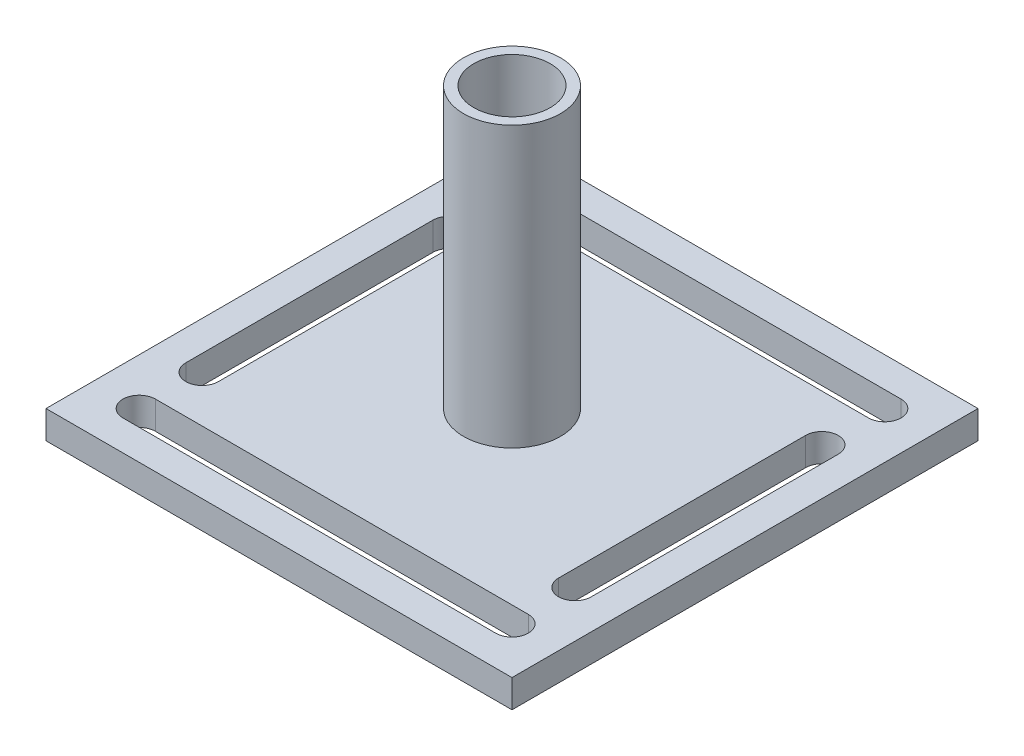
ISO-10303-21;
HEADER;
FILE_DESCRIPTION(('STEP AP214'),'2;1');
FILE_NAME('part.step','',(''),(''),'','','');
FILE_SCHEMA(('AUTOMOTIVE_DESIGN { 1 0 10303 214 1 1 1 1 }'));
ENDSEC;
DATA;
#1=APPLICATION_CONTEXT('core data for automotive mechanical design processes');
#2=APPLICATION_PROTOCOL_DEFINITION('international standard','automotive_design',2000,#1);
#3=PRODUCT_CONTEXT('',#1,'mechanical');
#4=PRODUCT('Part','Part','',(#3));
#5=PRODUCT_RELATED_PRODUCT_CATEGORY('part','',(#4));
#6=PRODUCT_DEFINITION_FORMATION('','',#4);
#7=PRODUCT_DEFINITION_CONTEXT('part definition',#1,'design');
#8=PRODUCT_DEFINITION('design','',#6,#7);
#9=PRODUCT_DEFINITION_SHAPE('','',#8);
#10=(LENGTH_UNIT() NAMED_UNIT(*) SI_UNIT(.MILLI.,.METRE.));
#11=(NAMED_UNIT(*) PLANE_ANGLE_UNIT() SI_UNIT($,.RADIAN.));
#12=(NAMED_UNIT(*) SI_UNIT($,.STERADIAN.) SOLID_ANGLE_UNIT());
#13=UNCERTAINTY_MEASURE_WITH_UNIT(LENGTH_MEASURE(1.E-05),#10,'distance_accuracy_value','');
#14=(GEOMETRIC_REPRESENTATION_CONTEXT(3) GLOBAL_UNCERTAINTY_ASSIGNED_CONTEXT((#13)) GLOBAL_UNIT_ASSIGNED_CONTEXT((#10,
#11,#12)) REPRESENTATION_CONTEXT('',''));
#15=CARTESIAN_POINT('',(0.,0.,0.));
#16=DIRECTION('',(0.,0.,1.));
#17=DIRECTION('',(1.,0.,0.));
#18=AXIS2_PLACEMENT_3D('',#15,#16,#17);
#19=CARTESIAN_POINT('',(0.,3.,0.));
#20=DIRECTION('',(0.,-1.,0.));
#21=DIRECTION('',(0.,0.,-1.));
#22=AXIS2_PLACEMENT_3D('',#19,#20,#21);
#23=PLANE('',#22);
#24=CARTESIAN_POINT('',(45.,3.,-38.25));
#25=DIRECTION('',(0.,-1.,0.));
#26=DIRECTION('',(0.,0.,-1.));
#27=AXIS2_PLACEMENT_3D('',#24,#25,#26);
#28=CIRCLE('',#27,1.75000000000001);
#29=CARTESIAN_POINT('',(46.75,3.,-38.25));
#30=VERTEX_POINT('',#29);
#31=CARTESIAN_POINT('',(43.25,3.,-38.25));
#32=VERTEX_POINT('',#31);
#33=EDGE_CURVE('E347',#30,#32,#28,.F.);
#34=ORIENTED_EDGE('',*,*,#33,.F.);
#35=DIRECTION('',(0.,0.,-1.));
#36=VECTOR('',#35,1.);
#37=CARTESIAN_POINT('',(46.75,3.,0.));
#38=LINE('',#37,#36);
#39=CARTESIAN_POINT('',(46.75,3.,-11.75));
#40=VERTEX_POINT('',#39);
#41=EDGE_CURVE('E337',#40,#30,#38,.T.);
#42=ORIENTED_EDGE('',*,*,#41,.F.);
#43=CARTESIAN_POINT('',(45.,3.,-11.75));
#44=DIRECTION('',(0.,-1.,0.));
#45=DIRECTION('',(0.,0.,-1.));
#46=AXIS2_PLACEMENT_3D('',#43,#44,#45);
#47=CIRCLE('',#46,1.75);
#48=CARTESIAN_POINT('',(43.25,3.,-11.75));
#49=VERTEX_POINT('',#48);
#50=EDGE_CURVE('E340',#49,#40,#47,.F.);
#51=ORIENTED_EDGE('',*,*,#50,.F.);
#52=DIRECTION('',(0.,0.,-1.));
#53=VECTOR('',#52,1.);
#54=CARTESIAN_POINT('',(43.25,3.,0.));
#55=LINE('',#54,#53);
#56=EDGE_CURVE('E343',#49,#32,#55,.T.);
#57=ORIENTED_EDGE('',*,*,#56,.T.);
#58=EDGE_LOOP('',(#34,#42,#51,#57));
#59=FACE_BOUND('',#58,.T.);
#60=CARTESIAN_POINT('',(5.,3.,-5.));
#61=DIRECTION('',(0.,-1.,0.));
#62=DIRECTION('',(0.,0.,-1.));
#63=AXIS2_PLACEMENT_3D('',#60,#61,#62);
#64=CIRCLE('',#63,1.75);
#65=CARTESIAN_POINT('',(5.,3.,-3.25000000000001));
#66=VERTEX_POINT('',#65);
#67=CARTESIAN_POINT('',(5.,3.,-6.75000000000001));
#68=VERTEX_POINT('',#67);
#69=EDGE_CURVE('E329',#66,#68,#64,.T.);
#70=ORIENTED_EDGE('',*,*,#69,.T.);
#71=DIRECTION('',(1.,0.,0.));
#72=VECTOR('',#71,1.);
#73=CARTESIAN_POINT('',(0.,3.,-6.75000000000001));
#74=LINE('',#73,#72);
#75=CARTESIAN_POINT('',(45.,3.,-6.75000000000001));
#76=VERTEX_POINT('',#75);
#77=EDGE_CURVE('E333',#68,#76,#74,.T.);
#78=ORIENTED_EDGE('',*,*,#77,.T.);
#79=CARTESIAN_POINT('',(45.,3.,-5.));
#80=DIRECTION('',(0.,-1.,0.));
#81=DIRECTION('',(0.,0.,-1.));
#82=AXIS2_PLACEMENT_3D('',#79,#80,#81);
#83=CIRCLE('',#82,1.75);
#84=CARTESIAN_POINT('',(45.,3.,-3.25));
#85=VERTEX_POINT('',#84);
#86=EDGE_CURVE('E324',#76,#85,#83,.T.);
#87=ORIENTED_EDGE('',*,*,#86,.T.);
#88=DIRECTION('',(1.,0.,0.));
#89=VECTOR('',#88,1.);
#90=CARTESIAN_POINT('',(0.,3.,-3.25000000000001));
#91=LINE('',#90,#89);
#92=EDGE_CURVE('E189',#66,#85,#91,.T.);
#93=ORIENTED_EDGE('',*,*,#92,.F.);
#94=EDGE_LOOP('',(#70,#78,#87,#93));
#95=FACE_BOUND('',#94,.T.);
#96=CARTESIAN_POINT('',(5.00000000000001,3.,-11.75));
#97=DIRECTION('',(0.,-1.,0.));
#98=DIRECTION('',(0.,0.,-1.));
#99=AXIS2_PLACEMENT_3D('',#96,#97,#98);
#100=CIRCLE('',#99,1.75);
#101=CARTESIAN_POINT('',(6.75000000000001,3.,-11.75));
#102=VERTEX_POINT('',#101);
#103=CARTESIAN_POINT('',(3.25,3.,-11.75));
#104=VERTEX_POINT('',#103);
#105=EDGE_CURVE('E316',#102,#104,#100,.T.);
#106=ORIENTED_EDGE('',*,*,#105,.T.);
#107=DIRECTION('',(0.,0.,-1.));
#108=VECTOR('',#107,1.);
#109=CARTESIAN_POINT('',(3.25,3.,0.));
#110=LINE('',#109,#108);
#111=CARTESIAN_POINT('',(3.25000000000001,3.,-38.25));
#112=VERTEX_POINT('',#111);
#113=EDGE_CURVE('E320',#104,#112,#110,.T.);
#114=ORIENTED_EDGE('',*,*,#113,.T.);
#115=CARTESIAN_POINT('',(5.00000000000001,3.,-38.25));
#116=DIRECTION('',(0.,-1.,0.));
#117=DIRECTION('',(0.,0.,-1.));
#118=AXIS2_PLACEMENT_3D('',#115,#116,#117);
#119=CIRCLE('',#118,1.75);
#120=CARTESIAN_POINT('',(6.75000000000001,3.,-38.25));
#121=VERTEX_POINT('',#120);
#122=EDGE_CURVE('E299',#112,#121,#119,.T.);
#123=ORIENTED_EDGE('',*,*,#122,.T.);
#124=DIRECTION('',(0.,0.,-1.));
#125=VECTOR('',#124,1.);
#126=CARTESIAN_POINT('',(6.75,3.,0.));
#127=LINE('',#126,#125);
#128=EDGE_CURVE('E312',#102,#121,#127,.T.);
#129=ORIENTED_EDGE('',*,*,#128,.F.);
#130=EDGE_LOOP('',(#106,#114,#123,#129));
#131=FACE_BOUND('',#130,.T.);
#132=CARTESIAN_POINT('',(25.,3.,-25.));
#133=DIRECTION('',(0.,-1.,0.));
#134=DIRECTION('',(0.,0.,-1.));
#135=AXIS2_PLACEMENT_3D('',#132,#133,#134);
#136=CIRCLE('',#135,5.2);
#137=CARTESIAN_POINT('',(25.,3.,-30.2));
#138=VERTEX_POINT('',#137);
#139=EDGE_CURVE('E11',#138,#138,#136,.F.);
#140=ORIENTED_EDGE('',*,*,#139,.F.);
#141=EDGE_LOOP('',(#140));
#142=FACE_BOUND('',#141,.T.);
#143=DIRECTION('',(0.,0.,1.));
#144=VECTOR('',#143,1.);
#145=CARTESIAN_POINT('',(0.,3.,0.));
#146=LINE('',#145,#144);
#147=CARTESIAN_POINT('',(0.,3.,-50.));
#148=VERTEX_POINT('',#147);
#149=CARTESIAN_POINT('',(0.,3.,0.));
#150=VERTEX_POINT('',#149);
#151=EDGE_CURVE('E375',#148,#150,#146,.T.);
#152=ORIENTED_EDGE('',*,*,#151,.T.);
#153=DIRECTION('',(1.,0.,0.));
#154=VECTOR('',#153,1.);
#155=CARTESIAN_POINT('',(0.,3.,0.));
#156=LINE('',#155,#154);
#157=CARTESIAN_POINT('',(50.,3.,0.));
#158=VERTEX_POINT('',#157);
#159=EDGE_CURVE('E379',#150,#158,#156,.T.);
#160=ORIENTED_EDGE('',*,*,#159,.T.);
#161=DIRECTION('',(0.,0.,-1.));
#162=VECTOR('',#161,1.);
#163=CARTESIAN_POINT('',(50.,3.,0.));
#164=LINE('',#163,#162);
#165=CARTESIAN_POINT('',(50.,3.,-50.));
#166=VERTEX_POINT('',#165);
#167=EDGE_CURVE('E383',#158,#166,#164,.T.);
#168=ORIENTED_EDGE('',*,*,#167,.T.);
#169=DIRECTION('',(-1.,0.,0.));
#170=VECTOR('',#169,1.);
#171=CARTESIAN_POINT('',(0.,3.,-50.));
#172=LINE('',#171,#170);
#173=EDGE_CURVE('E386',#166,#148,#172,.T.);
#174=ORIENTED_EDGE('',*,*,#173,.T.);
#175=EDGE_LOOP('',(#152,#160,#168,#174));
#176=FACE_BOUND('',#175,.T.);
#177=CARTESIAN_POINT('',(45.,3.,-45.));
#178=DIRECTION('',(0.,-1.,0.));
#179=DIRECTION('',(0.,0.,-1.));
#180=AXIS2_PLACEMENT_3D('',#177,#178,#179);
#181=CIRCLE('',#180,1.75);
#182=CARTESIAN_POINT('',(45.,3.,-43.25));
#183=VERTEX_POINT('',#182);
#184=CARTESIAN_POINT('',(45.,3.,-46.75));
#185=VERTEX_POINT('',#184);
#186=EDGE_CURVE('E359',#183,#185,#181,.F.);
#187=ORIENTED_EDGE('',*,*,#186,.F.);
#188=DIRECTION('',(1.,0.,0.));
#189=VECTOR('',#188,1.);
#190=CARTESIAN_POINT('',(0.,3.,-43.25));
#191=LINE('',#190,#189);
#192=CARTESIAN_POINT('',(5.,3.,-43.25));
#193=VERTEX_POINT('',#192);
#194=EDGE_CURVE('E350',#193,#183,#191,.T.);
#195=ORIENTED_EDGE('',*,*,#194,.F.);
#196=CARTESIAN_POINT('',(5.,3.,-45.));
#197=DIRECTION('',(0.,-1.,0.));
#198=DIRECTION('',(0.,0.,-1.));
#199=AXIS2_PLACEMENT_3D('',#196,#197,#198);
#200=CIRCLE('',#199,1.75);
#201=CARTESIAN_POINT('',(5.,3.,-46.75));
#202=VERTEX_POINT('',#201);
#203=EDGE_CURVE('E353',#202,#193,#200,.F.);
#204=ORIENTED_EDGE('',*,*,#203,.F.);
#205=DIRECTION('',(1.,0.,0.));
#206=VECTOR('',#205,1.);
#207=CARTESIAN_POINT('',(0.,3.,-46.75));
#208=LINE('',#207,#206);
#209=EDGE_CURVE('E356',#202,#185,#208,.T.);
#210=ORIENTED_EDGE('',*,*,#209,.T.);
#211=EDGE_LOOP('',(#187,#195,#204,#210));
#212=FACE_BOUND('',#211,.T.);
#213=ADVANCED_FACE('F43',(#59,#95,#131,#142,#176,#212),#23,.F.);
#214=CARTESIAN_POINT('',(0.,0.,0.));
#215=DIRECTION('',(0.,-1.,0.));
#216=DIRECTION('',(0.,0.,-1.));
#217=AXIS2_PLACEMENT_3D('',#214,#215,#216);
#218=PLANE('',#217);
#219=DIRECTION('',(1.,0.,0.));
#220=VECTOR('',#219,1.);
#221=CARTESIAN_POINT('',(0.,0.,-6.75000000000001));
#222=LINE('',#221,#220);
#223=CARTESIAN_POINT('',(5.,0.,-6.75000000000001));
#224=VERTEX_POINT('',#223);
#225=CARTESIAN_POINT('',(45.,0.,-6.75));
#226=VERTEX_POINT('',#225);
#227=EDGE_CURVE('E204',#224,#226,#222,.T.);
#228=ORIENTED_EDGE('',*,*,#227,.F.);
#229=CARTESIAN_POINT('',(5.,0.,-5.));
#230=DIRECTION('',(0.,-1.,0.));
#231=DIRECTION('',(0.,0.,-1.));
#232=AXIS2_PLACEMENT_3D('',#229,#230,#231);
#233=CIRCLE('',#232,1.75);
#234=CARTESIAN_POINT('',(5.,0.,-3.25000000000001));
#235=VERTEX_POINT('',#234);
#236=EDGE_CURVE('E209',#235,#224,#233,.T.);
#237=ORIENTED_EDGE('',*,*,#236,.F.);
#238=DIRECTION('',(1.,0.,0.));
#239=VECTOR('',#238,1.);
#240=CARTESIAN_POINT('',(0.,0.,-3.25000000000001));
#241=LINE('',#240,#239);
#242=CARTESIAN_POINT('',(45.,0.,-3.25000000000001));
#243=VERTEX_POINT('',#242);
#244=EDGE_CURVE('E186',#235,#243,#241,.T.);
#245=ORIENTED_EDGE('',*,*,#244,.T.);
#246=CARTESIAN_POINT('',(45.,0.,-5.));
#247=DIRECTION('',(0.,-1.,0.));
#248=DIRECTION('',(0.,0.,-1.));
#249=AXIS2_PLACEMENT_3D('',#246,#247,#248);
#250=CIRCLE('',#249,1.75);
#251=EDGE_CURVE('E198',#226,#243,#250,.T.);
#252=ORIENTED_EDGE('',*,*,#251,.F.);
#253=EDGE_LOOP('',(#228,#237,#245,#252));
#254=FACE_BOUND('',#253,.T.);
#255=DIRECTION('',(0.,0.,-1.));
#256=VECTOR('',#255,1.);
#257=CARTESIAN_POINT('',(3.25,0.,0.));
#258=LINE('',#257,#256);
#259=CARTESIAN_POINT('',(3.25,0.,-11.75));
#260=VERTEX_POINT('',#259);
#261=CARTESIAN_POINT('',(3.25000000000001,0.,-38.25));
#262=VERTEX_POINT('',#261);
#263=EDGE_CURVE('E221',#260,#262,#258,.T.);
#264=ORIENTED_EDGE('',*,*,#263,.F.);
#265=CARTESIAN_POINT('',(5.00000000000001,0.,-11.75));
#266=DIRECTION('',(0.,-1.,0.));
#267=DIRECTION('',(0.,0.,-1.));
#268=AXIS2_PLACEMENT_3D('',#265,#266,#267);
#269=CIRCLE('',#268,1.75);
#270=CARTESIAN_POINT('',(6.75000000000001,0.,-11.75));
#271=VERTEX_POINT('',#270);
#272=EDGE_CURVE('E291',#271,#260,#269,.T.);
#273=ORIENTED_EDGE('',*,*,#272,.F.);
#274=DIRECTION('',(0.,0.,-1.));
#275=VECTOR('',#274,1.);
#276=CARTESIAN_POINT('',(6.75,0.,0.));
#277=LINE('',#276,#275);
#278=CARTESIAN_POINT('',(6.75000000000001,0.,-38.25));
#279=VERTEX_POINT('',#278);
#280=EDGE_CURVE('E287',#271,#279,#277,.T.);
#281=ORIENTED_EDGE('',*,*,#280,.T.);
#282=CARTESIAN_POINT('',(5.00000000000001,0.,-38.25));
#283=DIRECTION('',(0.,-1.,0.));
#284=DIRECTION('',(0.,0.,-1.));
#285=AXIS2_PLACEMENT_3D('',#282,#283,#284);
#286=CIRCLE('',#285,1.75);
#287=EDGE_CURVE('E283',#262,#279,#286,.T.);
#288=ORIENTED_EDGE('',*,*,#287,.F.);
#289=EDGE_LOOP('',(#264,#273,#281,#288));
#290=FACE_BOUND('',#289,.T.);
#291=DIRECTION('',(0.,0.,1.));
#292=VECTOR('',#291,1.);
#293=CARTESIAN_POINT('',(0.,0.,0.));
#294=LINE('',#293,#292);
#295=CARTESIAN_POINT('',(0.,0.,-50.));
#296=VERTEX_POINT('',#295);
#297=CARTESIAN_POINT('',(0.,0.,0.));
#298=VERTEX_POINT('',#297);
#299=EDGE_CURVE('E374',#296,#298,#294,.T.);
#300=ORIENTED_EDGE('',*,*,#299,.F.);
#301=DIRECTION('',(-1.,0.,0.));
#302=VECTOR('',#301,1.);
#303=CARTESIAN_POINT('',(0.,0.,-50.));
#304=LINE('',#303,#302);
#305=CARTESIAN_POINT('',(50.,0.,-50.));
#306=VERTEX_POINT('',#305);
#307=EDGE_CURVE('E380',#306,#296,#304,.T.);
#308=ORIENTED_EDGE('',*,*,#307,.F.);
#309=DIRECTION('',(0.,0.,-1.));
#310=VECTOR('',#309,1.);
#311=CARTESIAN_POINT('',(50.,0.,0.));
#312=LINE('',#311,#310);
#313=CARTESIAN_POINT('',(50.,0.,0.));
#314=VERTEX_POINT('',#313);
#315=EDGE_CURVE('E396',#314,#306,#312,.T.);
#316=ORIENTED_EDGE('',*,*,#315,.F.);
#317=DIRECTION('',(1.,0.,0.));
#318=VECTOR('',#317,1.);
#319=CARTESIAN_POINT('',(0.,0.,0.));
#320=LINE('',#319,#318);
#321=EDGE_CURVE('E393',#298,#314,#320,.T.);
#322=ORIENTED_EDGE('',*,*,#321,.F.);
#323=EDGE_LOOP('',(#300,#308,#316,#322));
#324=FACE_BOUND('',#323,.T.);
#325=DIRECTION('',(0.,0.,-1.));
#326=VECTOR('',#325,1.);
#327=CARTESIAN_POINT('',(46.75,0.,0.));
#328=LINE('',#327,#326);
#329=CARTESIAN_POINT('',(46.75,0.,-11.75));
#330=VERTEX_POINT('',#329);
#331=CARTESIAN_POINT('',(46.75,0.,-38.25));
#332=VERTEX_POINT('',#331);
#333=EDGE_CURVE('E229',#330,#332,#328,.T.);
#334=ORIENTED_EDGE('',*,*,#333,.T.);
#335=CARTESIAN_POINT('',(45.,0.,-38.25));
#336=DIRECTION('',(0.,-1.,0.));
#337=DIRECTION('',(0.,0.,-1.));
#338=AXIS2_PLACEMENT_3D('',#335,#336,#337);
#339=CIRCLE('',#338,1.75000000000001);
#340=CARTESIAN_POINT('',(43.25,0.,-38.25));
#341=VERTEX_POINT('',#340);
#342=EDGE_CURVE('E226',#332,#341,#339,.F.);
#343=ORIENTED_EDGE('',*,*,#342,.T.);
#344=DIRECTION('',(0.,0.,-1.));
#345=VECTOR('',#344,1.);
#346=CARTESIAN_POINT('',(43.25,0.,0.));
#347=LINE('',#346,#345);
#348=CARTESIAN_POINT('',(43.25,0.,-11.75));
#349=VERTEX_POINT('',#348);
#350=EDGE_CURVE('E238',#349,#341,#347,.T.);
#351=ORIENTED_EDGE('',*,*,#350,.F.);
#352=CARTESIAN_POINT('',(45.,0.,-11.75));
#353=DIRECTION('',(0.,-1.,0.));
#354=DIRECTION('',(0.,0.,-1.));
#355=AXIS2_PLACEMENT_3D('',#352,#353,#354);
#356=CIRCLE('',#355,1.75);
#357=EDGE_CURVE('E234',#349,#330,#356,.F.);
#358=ORIENTED_EDGE('',*,*,#357,.T.);
#359=EDGE_LOOP('',(#334,#343,#351,#358));
#360=FACE_BOUND('',#359,.T.);
#361=DIRECTION('',(1.,0.,0.));
#362=VECTOR('',#361,1.);
#363=CARTESIAN_POINT('',(0.,0.,-43.25));
#364=LINE('',#363,#362);
#365=CARTESIAN_POINT('',(5.,0.,-43.25));
#366=VERTEX_POINT('',#365);
#367=CARTESIAN_POINT('',(45.,0.,-43.25));
#368=VERTEX_POINT('',#367);
#369=EDGE_CURVE('E258',#366,#368,#364,.T.);
#370=ORIENTED_EDGE('',*,*,#369,.T.);
#371=CARTESIAN_POINT('',(45.,0.,-45.));
#372=DIRECTION('',(0.,-1.,0.));
#373=DIRECTION('',(0.,0.,-1.));
#374=AXIS2_PLACEMENT_3D('',#371,#372,#373);
#375=CIRCLE('',#374,1.75);
#376=CARTESIAN_POINT('',(45.,0.,-46.75));
#377=VERTEX_POINT('',#376);
#378=EDGE_CURVE('E254',#368,#377,#375,.F.);
#379=ORIENTED_EDGE('',*,*,#378,.T.);
#380=DIRECTION('',(1.,0.,0.));
#381=VECTOR('',#380,1.);
#382=CARTESIAN_POINT('',(0.,0.,-46.75));
#383=LINE('',#382,#381);
#384=CARTESIAN_POINT('',(5.,0.,-46.75));
#385=VERTEX_POINT('',#384);
#386=EDGE_CURVE('E266',#385,#377,#383,.T.);
#387=ORIENTED_EDGE('',*,*,#386,.F.);
#388=CARTESIAN_POINT('',(5.,0.,-45.));
#389=DIRECTION('',(0.,-1.,0.));
#390=DIRECTION('',(0.,0.,-1.));
#391=AXIS2_PLACEMENT_3D('',#388,#389,#390);
#392=CIRCLE('',#391,1.75);
#393=EDGE_CURVE('E262',#385,#366,#392,.F.);
#394=ORIENTED_EDGE('',*,*,#393,.T.);
#395=EDGE_LOOP('',(#370,#379,#387,#394));
#396=FACE_BOUND('',#395,.T.);
#397=ADVANCED_FACE('F206',(#254,#290,#324,#360,#396),#218,.T.);
#398=CARTESIAN_POINT('',(0.,3.,0.));
#399=DIRECTION('',(1.,0.,0.));
#400=DIRECTION('',(0.,0.,-1.));
#401=AXIS2_PLACEMENT_3D('',#398,#399,#400);
#402=PLANE('',#401);
#403=ORIENTED_EDGE('',*,*,#299,.T.);
#404=DIRECTION('',(0.,-1.,0.));
#405=VECTOR('',#404,1.);
#406=CARTESIAN_POINT('',(0.,3.,0.));
#407=LINE('',#406,#405);
#408=EDGE_CURVE('E52',#150,#298,#407,.T.);
#409=ORIENTED_EDGE('',*,*,#408,.F.);
#410=ORIENTED_EDGE('',*,*,#151,.F.);
#411=DIRECTION('',(0.,-1.,0.));
#412=VECTOR('',#411,1.);
#413=CARTESIAN_POINT('',(0.,3.,-50.));
#414=LINE('',#413,#412);
#415=EDGE_CURVE('E389',#148,#296,#414,.T.);
#416=ORIENTED_EDGE('',*,*,#415,.T.);
#417=EDGE_LOOP('',(#403,#409,#410,#416));
#418=FACE_BOUND('',#417,.T.);
#419=ADVANCED_FACE('F45',(#418),#402,.F.);
#420=CARTESIAN_POINT('',(0.,3.,0.));
#421=DIRECTION('',(0.,0.,-1.));
#422=DIRECTION('',(-1.,0.,0.));
#423=AXIS2_PLACEMENT_3D('',#420,#421,#422);
#424=PLANE('',#423);
#425=ORIENTED_EDGE('',*,*,#321,.T.);
#426=DIRECTION('',(0.,-1.,0.));
#427=VECTOR('',#426,1.);
#428=CARTESIAN_POINT('',(50.,3.,0.));
#429=LINE('',#428,#427);
#430=EDGE_CURVE('E408',#158,#314,#429,.T.);
#431=ORIENTED_EDGE('',*,*,#430,.F.);
#432=ORIENTED_EDGE('',*,*,#159,.F.);
#433=ORIENTED_EDGE('',*,*,#408,.T.);
#434=EDGE_LOOP('',(#425,#431,#432,#433));
#435=FACE_BOUND('',#434,.T.);
#436=ADVANCED_FACE('F415',(#435),#424,.F.);
#437=CARTESIAN_POINT('',(50.,3.,0.));
#438=DIRECTION('',(-1.,0.,0.));
#439=DIRECTION('',(0.,0.,1.));
#440=AXIS2_PLACEMENT_3D('',#437,#438,#439);
#441=PLANE('',#440);
#442=ORIENTED_EDGE('',*,*,#315,.T.);
#443=DIRECTION('',(0.,-1.,0.));
#444=VECTOR('',#443,1.);
#445=CARTESIAN_POINT('',(50.,3.,-50.));
#446=LINE('',#445,#444);
#447=EDGE_CURVE('E404',#166,#306,#446,.T.);
#448=ORIENTED_EDGE('',*,*,#447,.F.);
#449=ORIENTED_EDGE('',*,*,#167,.F.);
#450=ORIENTED_EDGE('',*,*,#430,.T.);
#451=EDGE_LOOP('',(#442,#448,#449,#450));
#452=FACE_BOUND('',#451,.T.);
#453=ADVANCED_FACE('F427',(#452),#441,.F.);
#454=CARTESIAN_POINT('',(0.,3.,-50.));
#455=DIRECTION('',(0.,0.,1.));
#456=DIRECTION('',(1.,0.,0.));
#457=AXIS2_PLACEMENT_3D('',#454,#455,#456);
#458=PLANE('',#457);
#459=ORIENTED_EDGE('',*,*,#307,.T.);
#460=ORIENTED_EDGE('',*,*,#415,.F.);
#461=ORIENTED_EDGE('',*,*,#173,.F.);
#462=ORIENTED_EDGE('',*,*,#447,.T.);
#463=EDGE_LOOP('',(#459,#460,#461,#462));
#464=FACE_BOUND('',#463,.T.);
#465=ADVANCED_FACE('F431',(#464),#458,.F.);
#466=CARTESIAN_POINT('',(25.,33.,-25.));
#467=DIRECTION('',(0.,-1.,0.));
#468=DIRECTION('',(0.,0.,-1.));
#469=AXIS2_PLACEMENT_3D('',#466,#467,#468);
#470=CYLINDRICAL_SURFACE('',#469,5.2);
#471=CARTESIAN_POINT('',(25.,33.,-25.));
#472=DIRECTION('',(0.,1.,0.));
#473=DIRECTION('',(0.,0.,1.));
#474=AXIS2_PLACEMENT_3D('',#471,#472,#473);
#475=CIRCLE('',#474,5.2);
#476=CARTESIAN_POINT('',(25.,33.,-19.8));
#477=VERTEX_POINT('',#476);
#478=EDGE_CURVE('E367',#477,#477,#475,.T.);
#479=ORIENTED_EDGE('',*,*,#478,.F.);
#480=EDGE_LOOP('',(#479));
#481=FACE_BOUND('',#480,.T.);
#482=ORIENTED_EDGE('',*,*,#139,.T.);
#483=EDGE_LOOP('',(#482));
#484=FACE_BOUND('',#483,.T.);
#485=ADVANCED_FACE('F494',(#481,#484),#470,.T.);
#486=CARTESIAN_POINT('',(25.,33.,-25.));
#487=DIRECTION('',(0.,1.,0.));
#488=DIRECTION('',(0.,0.,1.));
#489=AXIS2_PLACEMENT_3D('',#486,#487,#488);
#490=PLANE('',#489);
#491=CARTESIAN_POINT('',(25.,33.,-25.));
#492=DIRECTION('',(0.,1.,0.));
#493=DIRECTION('',(0.,0.,1.));
#494=AXIS2_PLACEMENT_3D('',#491,#492,#493);
#495=CIRCLE('',#494,4.1);
#496=CARTESIAN_POINT('',(25.,33.,-20.9));
#497=VERTEX_POINT('',#496);
#498=EDGE_CURVE('E362',#497,#497,#495,.T.);
#499=ORIENTED_EDGE('',*,*,#498,.F.);
#500=EDGE_LOOP('',(#499));
#501=FACE_BOUND('',#500,.T.);
#502=ORIENTED_EDGE('',*,*,#478,.T.);
#503=EDGE_LOOP('',(#502));
#504=FACE_BOUND('',#503,.T.);
#505=ADVANCED_FACE('F490',(#501,#504),#490,.T.);
#506=CARTESIAN_POINT('',(25.,3.,-25.));
#507=DIRECTION('',(0.,1.,0.));
#508=DIRECTION('',(0.,0.,1.));
#509=AXIS2_PLACEMENT_3D('',#506,#507,#508);
#510=CYLINDRICAL_SURFACE('',#509,4.1);
#511=CARTESIAN_POINT('',(25.,3.,-25.));
#512=DIRECTION('',(0.,1.,0.));
#513=DIRECTION('',(0.,0.,1.));
#514=AXIS2_PLACEMENT_3D('',#511,#512,#513);
#515=CIRCLE('',#514,4.1);
#516=CARTESIAN_POINT('',(25.,3.,-20.9));
#517=VERTEX_POINT('',#516);
#518=EDGE_CURVE('E363',#517,#517,#515,.T.);
#519=ORIENTED_EDGE('',*,*,#518,.F.);
#520=EDGE_LOOP('',(#519));
#521=FACE_BOUND('',#520,.T.);
#522=ORIENTED_EDGE('',*,*,#498,.T.);
#523=EDGE_LOOP('',(#522));
#524=FACE_BOUND('',#523,.T.);
#525=ADVANCED_FACE('F486',(#521,#524),#510,.F.);
#526=CARTESIAN_POINT('',(25.,3.,-25.));
#527=DIRECTION('',(0.,1.,0.));
#528=DIRECTION('',(0.,0.,1.));
#529=AXIS2_PLACEMENT_3D('',#526,#527,#528);
#530=PLANE('',#529);
#531=ORIENTED_EDGE('',*,*,#518,.T.);
#532=EDGE_LOOP('',(#531));
#533=FACE_BOUND('',#532,.T.);
#534=ADVANCED_FACE('F482',(#533),#530,.T.);
#535=CARTESIAN_POINT('',(3.25,30.,0.));
#536=DIRECTION('',(-1.,0.,0.));
#537=DIRECTION('',(0.,0.,1.));
#538=AXIS2_PLACEMENT_3D('',#535,#536,#537);
#539=PLANE('',#538);
#540=DIRECTION('',(0.,-1.,0.));
#541=VECTOR('',#540,1.);
#542=CARTESIAN_POINT('',(3.25,30.,-11.75));
#543=LINE('',#542,#541);
#544=EDGE_CURVE('E296',#104,#260,#543,.T.);
#545=ORIENTED_EDGE('',*,*,#544,.T.);
#546=ORIENTED_EDGE('',*,*,#263,.T.);
#547=DIRECTION('',(0.,-1.,0.));
#548=VECTOR('',#547,1.);
#549=CARTESIAN_POINT('',(3.25000000000001,30.,-38.25));
#550=LINE('',#549,#548);
#551=EDGE_CURVE('E295',#112,#262,#550,.T.);
#552=ORIENTED_EDGE('',*,*,#551,.F.);
#553=ORIENTED_EDGE('',*,*,#113,.F.);
#554=EDGE_LOOP('',(#545,#546,#552,#553));
#555=FACE_BOUND('',#554,.T.);
#556=ADVANCED_FACE('F470',(#555),#539,.F.);
#557=CARTESIAN_POINT('',(5.00000000000001,30.,-11.75));
#558=DIRECTION('',(0.,-1.,0.));
#559=DIRECTION('',(0.,0.,-1.));
#560=AXIS2_PLACEMENT_3D('',#557,#558,#559);
#561=CYLINDRICAL_SURFACE('',#560,1.75);
#562=DIRECTION('',(0.,-1.,0.));
#563=VECTOR('',#562,1.);
#564=CARTESIAN_POINT('',(6.75000000000001,30.,-11.75));
#565=LINE('',#564,#563);
#566=EDGE_CURVE('E300',#102,#271,#565,.T.);
#567=ORIENTED_EDGE('',*,*,#566,.T.);
#568=ORIENTED_EDGE('',*,*,#272,.T.);
#569=ORIENTED_EDGE('',*,*,#544,.F.);
#570=ORIENTED_EDGE('',*,*,#105,.F.);
#571=EDGE_LOOP('',(#567,#568,#569,#570));
#572=FACE_BOUND('',#571,.T.);
#573=ADVANCED_FACE('F466',(#572),#561,.F.);
#574=CARTESIAN_POINT('',(6.75,30.,0.));
#575=DIRECTION('',(-1.,0.,0.));
#576=DIRECTION('',(0.,0.,1.));
#577=AXIS2_PLACEMENT_3D('',#574,#575,#576);
#578=PLANE('',#577);
#579=ORIENTED_EDGE('',*,*,#128,.T.);
#580=DIRECTION('',(0.,-1.,0.));
#581=VECTOR('',#580,1.);
#582=CARTESIAN_POINT('',(6.75000000000001,30.,-38.25));
#583=LINE('',#582,#581);
#584=EDGE_CURVE('E303',#121,#279,#583,.T.);
#585=ORIENTED_EDGE('',*,*,#584,.T.);
#586=ORIENTED_EDGE('',*,*,#280,.F.);
#587=ORIENTED_EDGE('',*,*,#566,.F.);
#588=EDGE_LOOP('',(#579,#585,#586,#587));
#589=FACE_BOUND('',#588,.T.);
#590=ADVANCED_FACE('F469',(#589),#578,.T.);
#591=CARTESIAN_POINT('',(5.00000000000001,30.,-38.25));
#592=DIRECTION('',(0.,-1.,0.));
#593=DIRECTION('',(0.,0.,-1.));
#594=AXIS2_PLACEMENT_3D('',#591,#592,#593);
#595=CYLINDRICAL_SURFACE('',#594,1.75);
#596=ORIENTED_EDGE('',*,*,#551,.T.);
#597=ORIENTED_EDGE('',*,*,#287,.T.);
#598=ORIENTED_EDGE('',*,*,#584,.F.);
#599=ORIENTED_EDGE('',*,*,#122,.F.);
#600=EDGE_LOOP('',(#596,#597,#598,#599));
#601=FACE_BOUND('',#600,.T.);
#602=ADVANCED_FACE('F474',(#601),#595,.F.);
#603=CARTESIAN_POINT('',(0.,30.,-6.75000000000001));
#604=DIRECTION('',(0.,0.,-1.));
#605=DIRECTION('',(-1.,0.,0.));
#606=AXIS2_PLACEMENT_3D('',#603,#604,#605);
#607=PLANE('',#606);
#608=DIRECTION('',(0.,-1.,0.));
#609=VECTOR('',#608,1.);
#610=CARTESIAN_POINT('',(5.,30.,-6.75000000000001));
#611=LINE('',#610,#609);
#612=EDGE_CURVE('E218',#68,#224,#611,.T.);
#613=ORIENTED_EDGE('',*,*,#612,.T.);
#614=ORIENTED_EDGE('',*,*,#227,.T.);
#615=DIRECTION('',(0.,-1.,0.));
#616=VECTOR('',#615,1.);
#617=CARTESIAN_POINT('',(45.,30.,-6.75000000000001));
#618=LINE('',#617,#616);
#619=EDGE_CURVE('E194',#76,#226,#618,.T.);
#620=ORIENTED_EDGE('',*,*,#619,.F.);
#621=ORIENTED_EDGE('',*,*,#77,.F.);
#622=EDGE_LOOP('',(#613,#614,#620,#621));
#623=FACE_BOUND('',#622,.T.);
#624=ADVANCED_FACE('F478',(#623),#607,.F.);
#625=CARTESIAN_POINT('',(5.,30.,-5.));
#626=DIRECTION('',(0.,-1.,0.));
#627=DIRECTION('',(0.,0.,-1.));
#628=AXIS2_PLACEMENT_3D('',#625,#626,#627);
#629=CYLINDRICAL_SURFACE('',#628,1.75);
#630=DIRECTION('',(0.,-1.,0.));
#631=VECTOR('',#630,1.);
#632=CARTESIAN_POINT('',(5.,30.,-3.25000000000001));
#633=LINE('',#632,#631);
#634=EDGE_CURVE('E193',#66,#235,#633,.T.);
#635=ORIENTED_EDGE('',*,*,#634,.T.);
#636=ORIENTED_EDGE('',*,*,#236,.T.);
#637=ORIENTED_EDGE('',*,*,#612,.F.);
#638=ORIENTED_EDGE('',*,*,#69,.F.);
#639=EDGE_LOOP('',(#635,#636,#637,#638));
#640=FACE_BOUND('',#639,.T.);
#641=ADVANCED_FACE('F566',(#640),#629,.F.);
#642=CARTESIAN_POINT('',(0.,30.,-3.25000000000001));
#643=DIRECTION('',(0.,0.,-1.));
#644=DIRECTION('',(-1.,0.,0.));
#645=AXIS2_PLACEMENT_3D('',#642,#643,#644);
#646=PLANE('',#645);
#647=ORIENTED_EDGE('',*,*,#92,.T.);
#648=DIRECTION('',(0.,-1.,0.));
#649=VECTOR('',#648,1.);
#650=CARTESIAN_POINT('',(45.,30.,-3.25000000000001));
#651=LINE('',#650,#649);
#652=EDGE_CURVE('E181',#85,#243,#651,.T.);
#653=ORIENTED_EDGE('',*,*,#652,.T.);
#654=ORIENTED_EDGE('',*,*,#244,.F.);
#655=ORIENTED_EDGE('',*,*,#634,.F.);
#656=EDGE_LOOP('',(#647,#653,#654,#655));
#657=FACE_BOUND('',#656,.T.);
#658=ADVANCED_FACE('F183',(#657),#646,.T.);
#659=CARTESIAN_POINT('',(45.,30.,-5.));
#660=DIRECTION('',(0.,-1.,0.));
#661=DIRECTION('',(0.,0.,-1.));
#662=AXIS2_PLACEMENT_3D('',#659,#660,#661);
#663=CYLINDRICAL_SURFACE('',#662,1.75);
#664=ORIENTED_EDGE('',*,*,#619,.T.);
#665=ORIENTED_EDGE('',*,*,#251,.T.);
#666=ORIENTED_EDGE('',*,*,#652,.F.);
#667=ORIENTED_EDGE('',*,*,#86,.F.);
#668=EDGE_LOOP('',(#664,#665,#666,#667));
#669=FACE_BOUND('',#668,.T.);
#670=ADVANCED_FACE('F199',(#669),#663,.F.);
#671=CARTESIAN_POINT('',(45.,30.,-38.25));
#672=DIRECTION('',(0.,-1.,0.));
#673=DIRECTION('',(0.,0.,-1.));
#674=AXIS2_PLACEMENT_3D('',#671,#672,#673);
#675=CYLINDRICAL_SURFACE('',#674,1.75000000000001);
#676=ORIENTED_EDGE('',*,*,#33,.T.);
#677=DIRECTION('',(0.,-1.,0.));
#678=VECTOR('',#677,1.);
#679=CARTESIAN_POINT('',(43.25,30.,-38.25));
#680=LINE('',#679,#678);
#681=EDGE_CURVE('E243',#32,#341,#680,.T.);
#682=ORIENTED_EDGE('',*,*,#681,.T.);
#683=ORIENTED_EDGE('',*,*,#342,.F.);
#684=DIRECTION('',(0.,-1.,0.));
#685=VECTOR('',#684,1.);
#686=CARTESIAN_POINT('',(46.75,30.,-38.25));
#687=LINE('',#686,#685);
#688=EDGE_CURVE('E242',#30,#332,#687,.T.);
#689=ORIENTED_EDGE('',*,*,#688,.F.);
#690=EDGE_LOOP('',(#676,#682,#683,#689));
#691=FACE_BOUND('',#690,.T.);
#692=ADVANCED_FACE('F596',(#691),#675,.F.);
#693=CARTESIAN_POINT('',(43.25,30.,0.));
#694=DIRECTION('',(-1.,0.,0.));
#695=DIRECTION('',(0.,0.,1.));
#696=AXIS2_PLACEMENT_3D('',#693,#694,#695);
#697=PLANE('',#696);
#698=DIRECTION('',(0.,-1.,0.));
#699=VECTOR('',#698,1.);
#700=CARTESIAN_POINT('',(43.25,30.,-11.75));
#701=LINE('',#700,#699);
#702=EDGE_CURVE('E246',#49,#349,#701,.T.);
#703=ORIENTED_EDGE('',*,*,#702,.T.);
#704=ORIENTED_EDGE('',*,*,#350,.T.);
#705=ORIENTED_EDGE('',*,*,#681,.F.);
#706=ORIENTED_EDGE('',*,*,#56,.F.);
#707=EDGE_LOOP('',(#703,#704,#705,#706));
#708=FACE_BOUND('',#707,.T.);
#709=ADVANCED_FACE('F606',(#708),#697,.F.);
#710=CARTESIAN_POINT('',(45.,30.,-11.75));
#711=DIRECTION('',(0.,-1.,0.));
#712=DIRECTION('',(0.,0.,-1.));
#713=AXIS2_PLACEMENT_3D('',#710,#711,#712);
#714=CYLINDRICAL_SURFACE('',#713,1.75);
#715=ORIENTED_EDGE('',*,*,#50,.T.);
#716=DIRECTION('',(0.,-1.,0.));
#717=VECTOR('',#716,1.);
#718=CARTESIAN_POINT('',(46.75,30.,-11.75));
#719=LINE('',#718,#717);
#720=EDGE_CURVE('E67',#40,#330,#719,.T.);
#721=ORIENTED_EDGE('',*,*,#720,.T.);
#722=ORIENTED_EDGE('',*,*,#357,.F.);
#723=ORIENTED_EDGE('',*,*,#702,.F.);
#724=EDGE_LOOP('',(#715,#721,#722,#723));
#725=FACE_BOUND('',#724,.T.);
#726=ADVANCED_FACE('F616',(#725),#714,.F.);
#727=CARTESIAN_POINT('',(46.75,30.,0.));
#728=DIRECTION('',(-1.,0.,0.));
#729=DIRECTION('',(0.,0.,1.));
#730=AXIS2_PLACEMENT_3D('',#727,#728,#729);
#731=PLANE('',#730);
#732=ORIENTED_EDGE('',*,*,#41,.T.);
#733=ORIENTED_EDGE('',*,*,#688,.T.);
#734=ORIENTED_EDGE('',*,*,#333,.F.);
#735=ORIENTED_EDGE('',*,*,#720,.F.);
#736=EDGE_LOOP('',(#732,#733,#734,#735));
#737=FACE_BOUND('',#736,.T.);
#738=ADVANCED_FACE('F465',(#737),#731,.T.);
#739=CARTESIAN_POINT('',(45.,30.,-45.));
#740=DIRECTION('',(0.,-1.,0.));
#741=DIRECTION('',(0.,0.,-1.));
#742=AXIS2_PLACEMENT_3D('',#739,#740,#741);
#743=CYLINDRICAL_SURFACE('',#742,1.75);
#744=ORIENTED_EDGE('',*,*,#186,.T.);
#745=DIRECTION('',(0.,-1.,0.));
#746=VECTOR('',#745,1.);
#747=CARTESIAN_POINT('',(45.,30.,-46.75));
#748=LINE('',#747,#746);
#749=EDGE_CURVE('E230',#185,#377,#748,.T.);
#750=ORIENTED_EDGE('',*,*,#749,.T.);
#751=ORIENTED_EDGE('',*,*,#378,.F.);
#752=DIRECTION('',(0.,-1.,0.));
#753=VECTOR('',#752,1.);
#754=CARTESIAN_POINT('',(45.,30.,-43.25));
#755=LINE('',#754,#753);
#756=EDGE_CURVE('E270',#183,#368,#755,.T.);
#757=ORIENTED_EDGE('',*,*,#756,.F.);
#758=EDGE_LOOP('',(#744,#750,#751,#757));
#759=FACE_BOUND('',#758,.T.);
#760=ADVANCED_FACE('F443',(#759),#743,.F.);
#761=CARTESIAN_POINT('',(0.,30.,-46.75));
#762=DIRECTION('',(0.,0.,-1.));
#763=DIRECTION('',(-1.,0.,0.));
#764=AXIS2_PLACEMENT_3D('',#761,#762,#763);
#765=PLANE('',#764);
#766=DIRECTION('',(0.,-1.,0.));
#767=VECTOR('',#766,1.);
#768=CARTESIAN_POINT('',(5.,30.,-46.75));
#769=LINE('',#768,#767);
#770=EDGE_CURVE('E273',#202,#385,#769,.T.);
#771=ORIENTED_EDGE('',*,*,#770,.T.);
#772=ORIENTED_EDGE('',*,*,#386,.T.);
#773=ORIENTED_EDGE('',*,*,#749,.F.);
#774=ORIENTED_EDGE('',*,*,#209,.F.);
#775=EDGE_LOOP('',(#771,#772,#773,#774));
#776=FACE_BOUND('',#775,.T.);
#777=ADVANCED_FACE('F445',(#776),#765,.F.);
#778=CARTESIAN_POINT('',(5.,30.,-45.));
#779=DIRECTION('',(0.,-1.,0.));
#780=DIRECTION('',(0.,0.,-1.));
#781=AXIS2_PLACEMENT_3D('',#778,#779,#780);
#782=CYLINDRICAL_SURFACE('',#781,1.75);
#783=ORIENTED_EDGE('',*,*,#203,.T.);
#784=DIRECTION('',(0.,-1.,0.));
#785=VECTOR('',#784,1.);
#786=CARTESIAN_POINT('',(5.,30.,-43.25));
#787=LINE('',#786,#785);
#788=EDGE_CURVE('E59',#193,#366,#787,.T.);
#789=ORIENTED_EDGE('',*,*,#788,.T.);
#790=ORIENTED_EDGE('',*,*,#393,.F.);
#791=ORIENTED_EDGE('',*,*,#770,.F.);
#792=EDGE_LOOP('',(#783,#789,#790,#791));
#793=FACE_BOUND('',#792,.T.);
#794=ADVANCED_FACE('F452',(#793),#782,.F.);
#795=CARTESIAN_POINT('',(0.,30.,-43.25));
#796=DIRECTION('',(0.,0.,-1.));
#797=DIRECTION('',(-1.,0.,0.));
#798=AXIS2_PLACEMENT_3D('',#795,#796,#797);
#799=PLANE('',#798);
#800=ORIENTED_EDGE('',*,*,#194,.T.);
#801=ORIENTED_EDGE('',*,*,#756,.T.);
#802=ORIENTED_EDGE('',*,*,#369,.F.);
#803=ORIENTED_EDGE('',*,*,#788,.F.);
#804=EDGE_LOOP('',(#800,#801,#802,#803));
#805=FACE_BOUND('',#804,.T.);
#806=ADVANCED_FACE('F450',(#805),#799,.T.);
#807=CLOSED_SHELL('',(#213,#397,#419,#436,#453,#465,#485,#505,#525,#534,#556,#573,#590,#602,
#624,#641,#658,#670,#692,#709,#726,#738,#760,#777,#794,#806));
#808=MANIFOLD_SOLID_BREP('B2',#807);
#809=ADVANCED_BREP_SHAPE_REPRESENTATION('',(#18,#808),#14);
#810=SHAPE_DEFINITION_REPRESENTATION(#9,#809);
ENDSEC;
END-ISO-10303-21;
